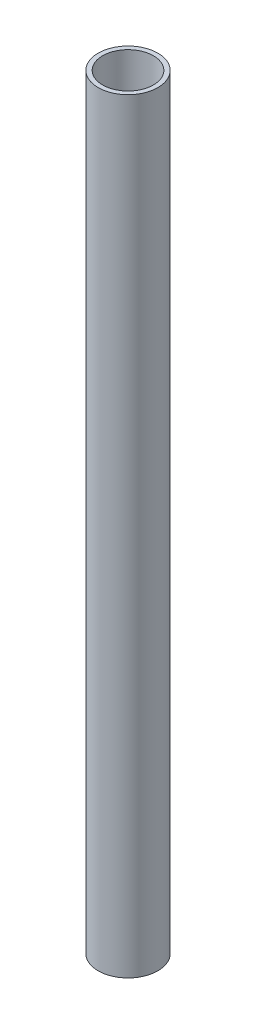
ISO-10303-21;
HEADER;
FILE_DESCRIPTION(('STEP AP214'),'2;1');
FILE_NAME('part.step','',(''),(''),'','','');
FILE_SCHEMA(('AUTOMOTIVE_DESIGN { 1 0 10303 214 1 1 1 1 }'));
ENDSEC;
DATA;
#1=APPLICATION_CONTEXT('core data for automotive mechanical design processes');
#2=APPLICATION_PROTOCOL_DEFINITION('international standard','automotive_design',2000,#1);
#3=PRODUCT_CONTEXT('',#1,'mechanical');
#4=PRODUCT('Part','Part','',(#3));
#5=PRODUCT_RELATED_PRODUCT_CATEGORY('part','',(#4));
#6=PRODUCT_DEFINITION_FORMATION('','',#4);
#7=PRODUCT_DEFINITION_CONTEXT('part definition',#1,'design');
#8=PRODUCT_DEFINITION('design','',#6,#7);
#9=PRODUCT_DEFINITION_SHAPE('','',#8);
#10=(LENGTH_UNIT() NAMED_UNIT(*) SI_UNIT(.MILLI.,.METRE.));
#11=(NAMED_UNIT(*) PLANE_ANGLE_UNIT() SI_UNIT($,.RADIAN.));
#12=(NAMED_UNIT(*) SI_UNIT($,.STERADIAN.) SOLID_ANGLE_UNIT());
#13=UNCERTAINTY_MEASURE_WITH_UNIT(LENGTH_MEASURE(1.E-05),#10,'distance_accuracy_value','');
#14=(GEOMETRIC_REPRESENTATION_CONTEXT(3) GLOBAL_UNCERTAINTY_ASSIGNED_CONTEXT((#13)) GLOBAL_UNIT_ASSIGNED_CONTEXT((#10,
#11,#12)) REPRESENTATION_CONTEXT('',''));
#15=CARTESIAN_POINT('',(0.,0.,0.));
#16=DIRECTION('',(0.,0.,1.));
#17=DIRECTION('',(1.,0.,0.));
#18=AXIS2_PLACEMENT_3D('',#15,#16,#17);
#19=CARTESIAN_POINT('',(0.,410.,0.));
#20=DIRECTION('',(0.,1.,0.));
#21=DIRECTION('',(0.,0.,1.));
#22=AXIS2_PLACEMENT_3D('',#19,#20,#21);
#23=PLANE('',#22);
#24=CARTESIAN_POINT('',(0.,410.,0.));
#25=DIRECTION('',(0.,1.,0.));
#26=DIRECTION('',(0.,0.,1.));
#27=AXIS2_PLACEMENT_3D('',#24,#25,#26);
#28=CIRCLE('',#27,16.);
#29=CARTESIAN_POINT('',(0.,410.,-16.));
#30=VERTEX_POINT('',#29);
#31=EDGE_CURVE('E10',#30,#30,#28,.T.);
#32=ORIENTED_EDGE('',*,*,#31,.T.);
#33=EDGE_LOOP('',(#32));
#34=FACE_BOUND('',#33,.T.);
#35=CARTESIAN_POINT('',(0.,410.,0.));
#36=DIRECTION('',(0.,1.,0.));
#37=DIRECTION('',(0.,0.,1.));
#38=AXIS2_PLACEMENT_3D('',#35,#36,#37);
#39=CIRCLE('',#38,13.6);
#40=CARTESIAN_POINT('',(0.,410.,-13.6));
#41=VERTEX_POINT('',#40);
#42=EDGE_CURVE('E50',#41,#41,#39,.T.);
#43=ORIENTED_EDGE('',*,*,#42,.F.);
#44=EDGE_LOOP('',(#43));
#45=FACE_BOUND('',#44,.T.);
#46=ADVANCED_FACE('F39',(#34,#45),#23,.T.);
#47=CARTESIAN_POINT('',(0.,0.,0.));
#48=DIRECTION('',(0.,1.,0.));
#49=DIRECTION('',(0.,0.,1.));
#50=AXIS2_PLACEMENT_3D('',#47,#48,#49);
#51=PLANE('',#50);
#52=CARTESIAN_POINT('',(0.,0.,0.));
#53=DIRECTION('',(0.,1.,0.));
#54=DIRECTION('',(0.,0.,1.));
#55=AXIS2_PLACEMENT_3D('',#52,#53,#54);
#56=CIRCLE('',#55,16.);
#57=CARTESIAN_POINT('',(0.,0.,-16.));
#58=VERTEX_POINT('',#57);
#59=EDGE_CURVE('E43',#58,#58,#56,.T.);
#60=ORIENTED_EDGE('',*,*,#59,.F.);
#61=EDGE_LOOP('',(#60));
#62=FACE_BOUND('',#61,.T.);
#63=CARTESIAN_POINT('',(0.,0.,0.));
#64=DIRECTION('',(0.,1.,0.));
#65=DIRECTION('',(0.,0.,1.));
#66=AXIS2_PLACEMENT_3D('',#63,#64,#65);
#67=CIRCLE('',#66,13.6);
#68=CARTESIAN_POINT('',(0.,0.,-13.6));
#69=VERTEX_POINT('',#68);
#70=EDGE_CURVE('E52',#69,#69,#67,.T.);
#71=ORIENTED_EDGE('',*,*,#70,.T.);
#72=EDGE_LOOP('',(#71));
#73=FACE_BOUND('',#72,.T.);
#74=ADVANCED_FACE('F62',(#62,#73),#51,.F.);
#75=CARTESIAN_POINT('',(0.,410.,0.));
#76=DIRECTION('',(0.,-1.,0.));
#77=DIRECTION('',(0.,0.,-1.));
#78=AXIS2_PLACEMENT_3D('',#75,#76,#77);
#79=CYLINDRICAL_SURFACE('',#78,16.);
#80=CARTESIAN_POINT('',(0.,410.,-16.));
#81=CARTESIAN_POINT('',(0.,405.729166666667,-16.));
#82=CARTESIAN_POINT('',(0.,401.458333333333,-16.));
#83=CARTESIAN_POINT('',(0.,392.916666666667,-16.));
#84=CARTESIAN_POINT('',(0.,388.645833333333,-16.));
#85=CARTESIAN_POINT('',(0.,380.104166666667,-16.));
#86=CARTESIAN_POINT('',(0.,375.833333333333,-16.));
#87=CARTESIAN_POINT('',(0.,367.291666666667,-16.));
#88=CARTESIAN_POINT('',(0.,363.020833333333,-16.));
#89=CARTESIAN_POINT('',(0.,354.479166666667,-16.));
#90=CARTESIAN_POINT('',(0.,350.208333333333,-16.));
#91=CARTESIAN_POINT('',(0.,341.666666666667,-16.));
#92=CARTESIAN_POINT('',(0.,337.395833333333,-16.));
#93=CARTESIAN_POINT('',(0.,328.854166666667,-16.));
#94=CARTESIAN_POINT('',(0.,324.583333333333,-16.));
#95=CARTESIAN_POINT('',(0.,316.041666666667,-16.));
#96=CARTESIAN_POINT('',(0.,311.770833333333,-16.));
#97=CARTESIAN_POINT('',(0.,303.229166666667,-16.));
#98=CARTESIAN_POINT('',(0.,298.958333333333,-16.));
#99=CARTESIAN_POINT('',(0.,290.416666666667,-16.));
#100=CARTESIAN_POINT('',(0.,286.145833333333,-16.));
#101=CARTESIAN_POINT('',(0.,277.604166666667,-16.));
#102=CARTESIAN_POINT('',(0.,273.333333333333,-16.));
#103=CARTESIAN_POINT('',(0.,264.791666666667,-16.));
#104=CARTESIAN_POINT('',(0.,260.520833333333,-16.));
#105=CARTESIAN_POINT('',(0.,251.979166666667,-16.));
#106=CARTESIAN_POINT('',(0.,247.708333333333,-16.));
#107=CARTESIAN_POINT('',(0.,239.166666666667,-16.));
#108=CARTESIAN_POINT('',(0.,234.895833333333,-16.));
#109=CARTESIAN_POINT('',(0.,226.354166666667,-16.));
#110=CARTESIAN_POINT('',(0.,222.083333333333,-16.));
#111=CARTESIAN_POINT('',(0.,213.541666666667,-16.));
#112=CARTESIAN_POINT('',(0.,209.270833333333,-16.));
#113=CARTESIAN_POINT('',(0.,200.729166666667,-16.));
#114=CARTESIAN_POINT('',(0.,196.458333333333,-16.));
#115=CARTESIAN_POINT('',(0.,187.916666666667,-16.));
#116=CARTESIAN_POINT('',(0.,183.645833333333,-16.));
#117=CARTESIAN_POINT('',(0.,175.104166666667,-16.));
#118=CARTESIAN_POINT('',(0.,170.833333333333,-16.));
#119=CARTESIAN_POINT('',(0.,162.291666666667,-16.));
#120=CARTESIAN_POINT('',(0.,158.020833333333,-16.));
#121=CARTESIAN_POINT('',(0.,149.479166666667,-16.));
#122=CARTESIAN_POINT('',(0.,145.208333333333,-16.));
#123=CARTESIAN_POINT('',(0.,136.666666666667,-16.));
#124=CARTESIAN_POINT('',(0.,132.395833333333,-16.));
#125=CARTESIAN_POINT('',(0.,123.854166666667,-16.));
#126=CARTESIAN_POINT('',(0.,119.583333333333,-16.));
#127=CARTESIAN_POINT('',(0.,111.041666666667,-16.));
#128=CARTESIAN_POINT('',(0.,106.770833333333,-16.));
#129=CARTESIAN_POINT('',(0.,98.2291666666666,-16.));
#130=CARTESIAN_POINT('',(0.,93.9583333333333,-16.));
#131=CARTESIAN_POINT('',(0.,85.4166666666666,-16.));
#132=CARTESIAN_POINT('',(0.,81.1458333333333,-16.));
#133=CARTESIAN_POINT('',(0.,72.6041666666667,-16.));
#134=CARTESIAN_POINT('',(0.,68.3333333333333,-16.));
#135=CARTESIAN_POINT('',(0.,59.7916666666667,-16.));
#136=CARTESIAN_POINT('',(0.,55.5208333333333,-16.));
#137=CARTESIAN_POINT('',(0.,46.9791666666667,-16.));
#138=CARTESIAN_POINT('',(0.,42.7083333333333,-16.));
#139=CARTESIAN_POINT('',(0.,34.1666666666667,-16.));
#140=CARTESIAN_POINT('',(0.,29.8958333333333,-16.));
#141=CARTESIAN_POINT('',(0.,21.3541666666667,-16.));
#142=CARTESIAN_POINT('',(0.,17.0833333333333,-16.));
#143=CARTESIAN_POINT('',(0.,8.54166666666667,-16.));
#144=CARTESIAN_POINT('',(0.,4.27083333333333,-16.));
#145=CARTESIAN_POINT('',(0.,0.,-16.));
#146=B_SPLINE_CURVE_WITH_KNOTS('',3,(#80,#81,#82,#83,#84,#85,#86,#87,#88,#89,#90,#91,#92,#93,
#94,#95,#96,#97,#98,#99,#100,#101,#102,#103,#104,#105,#106,#107,#108,#109,#110,#111,#112,#113,
#114,#115,#116,#117,#118,#119,#120,#121,#122,#123,#124,#125,#126,#127,#128,#129,#130,#131,#132,
#133,#134,#135,#136,#137,#138,#139,#140,#141,#142,#143,#144,#145),.UNSPECIFIED.,.F.,.F.,(4,2,2,
2,2,2,2,2,2,2,2,2,2,2,2,2,2,2,2,2,2,2,2,2,2,2,2,2,2,2,2,2,4),(0.,12.8124999999999,25.625,
38.4375,51.25,64.0625,76.875,89.6874999999999,102.5,115.3125,128.125,140.9375,153.75,166.5625,
179.375,192.1875,205.,217.8125,230.625,243.4375,256.25,269.0625,281.875,294.6875,307.5,320.3125,
333.125,345.9375,358.75,371.5625,384.375,397.1875,410.),.UNSPECIFIED.);
#147=EDGE_CURVE('BSEAM41',#30,#58,#146,.T.);
#148=ORIENTED_EDGE('',*,*,#31,.F.);
#149=ORIENTED_EDGE('',*,*,#59,.T.);
#150=ORIENTED_EDGE('',*,*,#147,.T.);
#151=ORIENTED_EDGE('',*,*,#147,.F.);
#152=EDGE_LOOP('',(#148,#150,#149,#151));
#153=FACE_BOUND('',#152,.T.);
#154=ADVANCED_FACE('F41',(#153),#79,.T.);
#155=CARTESIAN_POINT('',(0.,410.,0.));
#156=DIRECTION('',(0.,-1.,0.));
#157=DIRECTION('',(0.,0.,-1.));
#158=AXIS2_PLACEMENT_3D('',#155,#156,#157);
#159=CYLINDRICAL_SURFACE('',#158,13.6);
#160=CARTESIAN_POINT('',(0.,410.,-13.6));
#161=CARTESIAN_POINT('',(0.,405.729166666667,-13.6));
#162=CARTESIAN_POINT('',(0.,401.458333333333,-13.6));
#163=CARTESIAN_POINT('',(0.,392.916666666667,-13.6));
#164=CARTESIAN_POINT('',(0.,388.645833333333,-13.6));
#165=CARTESIAN_POINT('',(0.,380.104166666667,-13.6));
#166=CARTESIAN_POINT('',(0.,375.833333333333,-13.6));
#167=CARTESIAN_POINT('',(0.,367.291666666667,-13.6));
#168=CARTESIAN_POINT('',(0.,363.020833333333,-13.6));
#169=CARTESIAN_POINT('',(0.,354.479166666667,-13.6));
#170=CARTESIAN_POINT('',(0.,350.208333333333,-13.6));
#171=CARTESIAN_POINT('',(0.,341.666666666667,-13.6));
#172=CARTESIAN_POINT('',(0.,337.395833333333,-13.6));
#173=CARTESIAN_POINT('',(0.,328.854166666667,-13.6));
#174=CARTESIAN_POINT('',(0.,324.583333333333,-13.6));
#175=CARTESIAN_POINT('',(0.,316.041666666667,-13.6));
#176=CARTESIAN_POINT('',(0.,311.770833333333,-13.6));
#177=CARTESIAN_POINT('',(0.,303.229166666667,-13.6));
#178=CARTESIAN_POINT('',(0.,298.958333333333,-13.6));
#179=CARTESIAN_POINT('',(0.,290.416666666667,-13.6));
#180=CARTESIAN_POINT('',(0.,286.145833333333,-13.6));
#181=CARTESIAN_POINT('',(0.,277.604166666667,-13.6));
#182=CARTESIAN_POINT('',(0.,273.333333333333,-13.6));
#183=CARTESIAN_POINT('',(0.,264.791666666667,-13.6));
#184=CARTESIAN_POINT('',(0.,260.520833333333,-13.6));
#185=CARTESIAN_POINT('',(0.,251.979166666667,-13.6));
#186=CARTESIAN_POINT('',(0.,247.708333333333,-13.6));
#187=CARTESIAN_POINT('',(0.,239.166666666667,-13.6));
#188=CARTESIAN_POINT('',(0.,234.895833333333,-13.6));
#189=CARTESIAN_POINT('',(0.,226.354166666667,-13.6));
#190=CARTESIAN_POINT('',(0.,222.083333333333,-13.6));
#191=CARTESIAN_POINT('',(0.,213.541666666667,-13.6));
#192=CARTESIAN_POINT('',(0.,209.270833333333,-13.6));
#193=CARTESIAN_POINT('',(0.,200.729166666667,-13.6));
#194=CARTESIAN_POINT('',(0.,196.458333333333,-13.6));
#195=CARTESIAN_POINT('',(0.,187.916666666667,-13.6));
#196=CARTESIAN_POINT('',(0.,183.645833333333,-13.6));
#197=CARTESIAN_POINT('',(0.,175.104166666667,-13.6));
#198=CARTESIAN_POINT('',(0.,170.833333333333,-13.6));
#199=CARTESIAN_POINT('',(0.,162.291666666667,-13.6));
#200=CARTESIAN_POINT('',(0.,158.020833333333,-13.6));
#201=CARTESIAN_POINT('',(0.,149.479166666667,-13.6));
#202=CARTESIAN_POINT('',(0.,145.208333333333,-13.6));
#203=CARTESIAN_POINT('',(0.,136.666666666667,-13.6));
#204=CARTESIAN_POINT('',(0.,132.395833333333,-13.6));
#205=CARTESIAN_POINT('',(0.,123.854166666667,-13.6));
#206=CARTESIAN_POINT('',(0.,119.583333333333,-13.6));
#207=CARTESIAN_POINT('',(0.,111.041666666667,-13.6));
#208=CARTESIAN_POINT('',(0.,106.770833333333,-13.6));
#209=CARTESIAN_POINT('',(0.,98.2291666666666,-13.6));
#210=CARTESIAN_POINT('',(0.,93.9583333333333,-13.6));
#211=CARTESIAN_POINT('',(0.,85.4166666666666,-13.6));
#212=CARTESIAN_POINT('',(0.,81.1458333333333,-13.6));
#213=CARTESIAN_POINT('',(0.,72.6041666666667,-13.6));
#214=CARTESIAN_POINT('',(0.,68.3333333333333,-13.6));
#215=CARTESIAN_POINT('',(0.,59.7916666666667,-13.6));
#216=CARTESIAN_POINT('',(0.,55.5208333333333,-13.6));
#217=CARTESIAN_POINT('',(0.,46.9791666666667,-13.6));
#218=CARTESIAN_POINT('',(0.,42.7083333333333,-13.6));
#219=CARTESIAN_POINT('',(0.,34.1666666666667,-13.6));
#220=CARTESIAN_POINT('',(0.,29.8958333333333,-13.6));
#221=CARTESIAN_POINT('',(0.,21.3541666666667,-13.6));
#222=CARTESIAN_POINT('',(0.,17.0833333333333,-13.6));
#223=CARTESIAN_POINT('',(0.,8.54166666666667,-13.6));
#224=CARTESIAN_POINT('',(0.,4.27083333333333,-13.6));
#225=CARTESIAN_POINT('',(0.,0.,-13.6));
#226=B_SPLINE_CURVE_WITH_KNOTS('',3,(#160,#161,#162,#163,#164,#165,#166,#167,#168,#169,#170,
#171,#172,#173,#174,#175,#176,#177,#178,#179,#180,#181,#182,#183,#184,#185,#186,#187,#188,#189,
#190,#191,#192,#193,#194,#195,#196,#197,#198,#199,#200,#201,#202,#203,#204,#205,#206,#207,#208,
#209,#210,#211,#212,#213,#214,#215,#216,#217,#218,#219,#220,#221,#222,#223,#224,#225),
.UNSPECIFIED.,.F.,.F.,(4,2,2,2,2,2,2,2,2,2,2,2,2,2,2,2,2,2,2,2,2,2,2,2,2,2,2,2,2,2,2,2,4),(0.,
12.8124999999999,25.625,38.4375,51.25,64.0625,76.875,89.6874999999999,102.5,115.3125,128.125,
140.9375,153.75,166.5625,179.375,192.1875,205.,217.8125,230.625,243.4375,256.25,269.0625,
281.875,294.6875,307.5,320.3125,333.125,345.9375,358.75,371.5625,384.375,397.1875,410.),.UNSPECIFIED.);
#227=EDGE_CURVE('BSEAM58',#41,#69,#226,.T.);
#228=ORIENTED_EDGE('',*,*,#42,.T.);
#229=ORIENTED_EDGE('',*,*,#70,.F.);
#230=ORIENTED_EDGE('',*,*,#227,.T.);
#231=ORIENTED_EDGE('',*,*,#227,.F.);
#232=EDGE_LOOP('',(#228,#230,#229,#231));
#233=FACE_BOUND('',#232,.T.);
#234=ADVANCED_FACE('F58',(#233),#159,.F.);
#235=CLOSED_SHELL('',(#46,#74,#154,#234));
#236=MANIFOLD_SOLID_BREP('B2',#235);
#237=ADVANCED_BREP_SHAPE_REPRESENTATION('',(#18,#236),#14);
#238=SHAPE_DEFINITION_REPRESENTATION(#9,#237);
ENDSEC;
END-ISO-10303-21;
